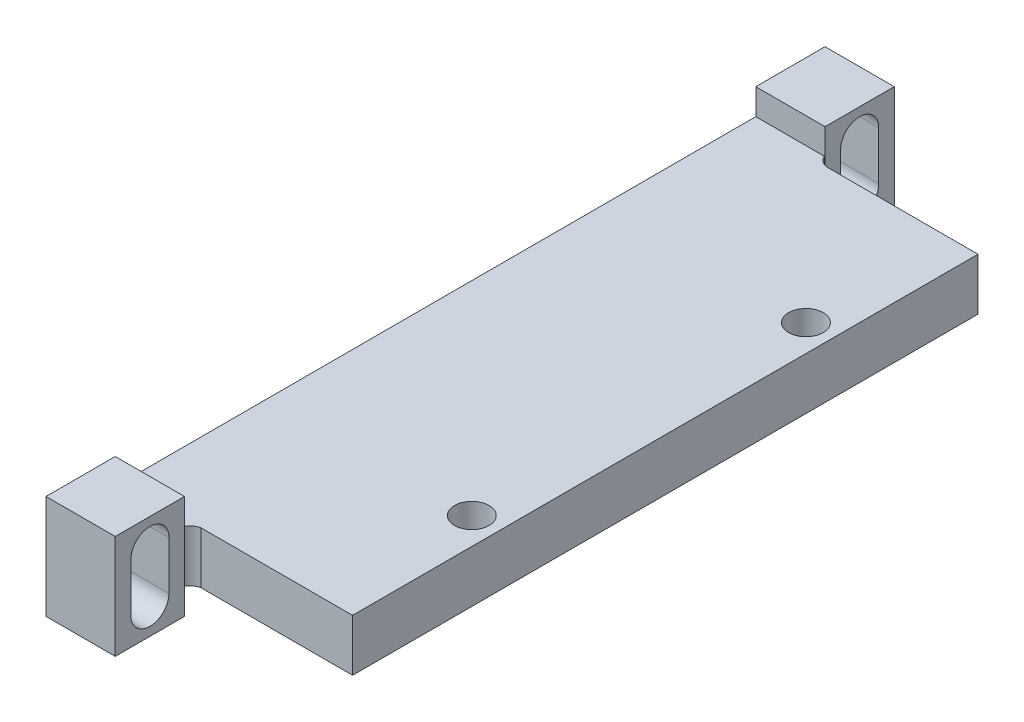
ISO-10303-21;
HEADER;
FILE_DESCRIPTION(('STEP AP214'),'2;1');
FILE_NAME('part.step','',(''),(''),'','','');
FILE_SCHEMA(('AUTOMOTIVE_DESIGN { 1 0 10303 214 1 1 1 1 }'));
ENDSEC;
DATA;
#1=APPLICATION_CONTEXT('core data for automotive mechanical design processes');
#2=APPLICATION_PROTOCOL_DEFINITION('international standard','automotive_design',2000,#1);
#3=PRODUCT_CONTEXT('',#1,'mechanical');
#4=PRODUCT('Part','Part','',(#3));
#5=PRODUCT_RELATED_PRODUCT_CATEGORY('part','',(#4));
#6=PRODUCT_DEFINITION_FORMATION('','',#4);
#7=PRODUCT_DEFINITION_CONTEXT('part definition',#1,'design');
#8=PRODUCT_DEFINITION('design','',#6,#7);
#9=PRODUCT_DEFINITION_SHAPE('','',#8);
#10=(LENGTH_UNIT() NAMED_UNIT(*) SI_UNIT(.MILLI.,.METRE.));
#11=(NAMED_UNIT(*) PLANE_ANGLE_UNIT() SI_UNIT($,.RADIAN.));
#12=(NAMED_UNIT(*) SI_UNIT($,.STERADIAN.) SOLID_ANGLE_UNIT());
#13=UNCERTAINTY_MEASURE_WITH_UNIT(LENGTH_MEASURE(1.E-05),#10,'distance_accuracy_value','');
#14=(GEOMETRIC_REPRESENTATION_CONTEXT(3) GLOBAL_UNCERTAINTY_ASSIGNED_CONTEXT((#13)) GLOBAL_UNIT_ASSIGNED_CONTEXT((#10,
#11,#12)) REPRESENTATION_CONTEXT('',''));
#15=CARTESIAN_POINT('',(0.,0.,0.));
#16=DIRECTION('',(0.,0.,1.));
#17=DIRECTION('',(1.,0.,0.));
#18=AXIS2_PLACEMENT_3D('',#15,#16,#17);
#19=CARTESIAN_POINT('',(2.,-3.,18.5));
#20=DIRECTION('',(1.,0.,0.));
#21=DIRECTION('',(0.,0.,-1.));
#22=AXIS2_PLACEMENT_3D('',#19,#20,#21);
#23=PLANE('',#22);
#24=CARTESIAN_POINT('',(2.,1.4,20.5));
#25=DIRECTION('',(1.,0.,0.));
#26=DIRECTION('',(0.,0.,-1.));
#27=AXIS2_PLACEMENT_3D('',#24,#25,#26);
#28=CIRCLE('',#27,1.1);
#29=CARTESIAN_POINT('',(2.,1.4,19.4));
#30=VERTEX_POINT('',#29);
#31=CARTESIAN_POINT('',(2.,1.4,21.6));
#32=VERTEX_POINT('',#31);
#33=EDGE_CURVE('E53',#30,#32,#28,.T.);
#34=ORIENTED_EDGE('',*,*,#33,.F.);
#35=DIRECTION('',(0.,1.,0.));
#36=VECTOR('',#35,1.);
#37=CARTESIAN_POINT('',(2.,1.4,19.4));
#38=LINE('',#37,#36);
#39=CARTESIAN_POINT('',(2.,-1.4,19.4));
#40=VERTEX_POINT('',#39);
#41=EDGE_CURVE('E216',#40,#30,#38,.T.);
#42=ORIENTED_EDGE('',*,*,#41,.F.);
#43=CARTESIAN_POINT('',(2.,-1.4,20.5));
#44=DIRECTION('',(1.,0.,0.));
#45=DIRECTION('',(0.,0.,-1.));
#46=AXIS2_PLACEMENT_3D('',#43,#44,#45);
#47=CIRCLE('',#46,1.1);
#48=CARTESIAN_POINT('',(2.,-1.4,21.6));
#49=VERTEX_POINT('',#48);
#50=EDGE_CURVE('E201',#49,#40,#47,.T.);
#51=ORIENTED_EDGE('',*,*,#50,.F.);
#52=DIRECTION('',(0.,-1.,0.));
#53=VECTOR('',#52,1.);
#54=CARTESIAN_POINT('',(2.,1.4,21.6));
#55=LINE('',#54,#53);
#56=EDGE_CURVE('E210',#32,#49,#55,.T.);
#57=ORIENTED_EDGE('',*,*,#56,.F.);
#58=EDGE_LOOP('',(#34,#42,#51,#57));
#59=FACE_BOUND('',#58,.T.);
#60=DIRECTION('',(0.,1.,0.));
#61=VECTOR('',#60,1.);
#62=CARTESIAN_POINT('',(2.,-3.,18.5));
#63=LINE('',#62,#61);
#64=CARTESIAN_POINT('',(2.,-3.,18.5));
#65=VERTEX_POINT('',#64);
#66=CARTESIAN_POINT('',(2.,3.,18.5));
#67=VERTEX_POINT('',#66);
#68=EDGE_CURVE('E664',#65,#67,#63,.T.);
#69=ORIENTED_EDGE('',*,*,#68,.T.);
#70=DIRECTION('',(0.,0.,-1.));
#71=VECTOR('',#70,1.);
#72=CARTESIAN_POINT('',(2.,3.,18.5));
#73=LINE('',#72,#71);
#74=CARTESIAN_POINT('',(2.,3.,22.5));
#75=VERTEX_POINT('',#74);
#76=EDGE_CURVE('E634',#75,#67,#73,.T.);
#77=ORIENTED_EDGE('',*,*,#76,.F.);
#78=DIRECTION('',(0.,1.,0.));
#79=VECTOR('',#78,1.);
#80=CARTESIAN_POINT('',(2.,-3.,22.5));
#81=LINE('',#80,#79);
#82=CARTESIAN_POINT('',(2.,-3.,22.5));
#83=VERTEX_POINT('',#82);
#84=EDGE_CURVE('E665',#83,#75,#81,.T.);
#85=ORIENTED_EDGE('',*,*,#84,.F.);
#86=DIRECTION('',(0.,0.,-1.));
#87=VECTOR('',#86,1.);
#88=CARTESIAN_POINT('',(2.,-3.,18.5));
#89=LINE('',#88,#87);
#90=EDGE_CURVE('E652',#83,#65,#89,.T.);
#91=ORIENTED_EDGE('',*,*,#90,.T.);
#92=EDGE_LOOP('',(#69,#77,#85,#91));
#93=FACE_BOUND('',#92,.T.);
#94=ADVANCED_FACE('F39',(#59,#93),#23,.T.);
#95=CARTESIAN_POINT('',(2.,-3.,22.5));
#96=DIRECTION('',(0.,0.,1.));
#97=DIRECTION('',(1.,0.,0.));
#98=AXIS2_PLACEMENT_3D('',#95,#96,#97);
#99=PLANE('',#98);
#100=ORIENTED_EDGE('',*,*,#84,.T.);
#101=DIRECTION('',(1.,0.,0.));
#102=VECTOR('',#101,1.);
#103=CARTESIAN_POINT('',(2.,3.,22.5));
#104=LINE('',#103,#102);
#105=CARTESIAN_POINT('',(-2.00000000000001,3.,22.5));
#106=VERTEX_POINT('',#105);
#107=EDGE_CURVE('E649',#106,#75,#104,.T.);
#108=ORIENTED_EDGE('',*,*,#107,.F.);
#109=DIRECTION('',(0.,1.,0.));
#110=VECTOR('',#109,1.);
#111=CARTESIAN_POINT('',(-2.00000000000001,-3.,22.5));
#112=LINE('',#111,#110);
#113=CARTESIAN_POINT('',(-2.00000000000001,-3.,22.5));
#114=VERTEX_POINT('',#113);
#115=EDGE_CURVE('E668',#114,#106,#112,.T.);
#116=ORIENTED_EDGE('',*,*,#115,.F.);
#117=DIRECTION('',(1.,0.,0.));
#118=VECTOR('',#117,1.);
#119=CARTESIAN_POINT('',(2.,-3.,22.5));
#120=LINE('',#119,#118);
#121=EDGE_CURVE('E661',#114,#83,#120,.T.);
#122=ORIENTED_EDGE('',*,*,#121,.T.);
#123=EDGE_LOOP('',(#100,#108,#116,#122));
#124=FACE_BOUND('',#123,.T.);
#125=ADVANCED_FACE('F363',(#124),#99,.T.);
#126=CARTESIAN_POINT('',(-1.99999999999999,-3.,18.5));
#127=DIRECTION('',(-1.,0.,0.));
#128=DIRECTION('',(0.,0.,1.));
#129=AXIS2_PLACEMENT_3D('',#126,#127,#128);
#130=PLANE('',#129);
#131=CARTESIAN_POINT('',(-2.,1.4,20.5));
#132=DIRECTION('',(-1.,0.,0.));
#133=DIRECTION('',(0.,0.,1.));
#134=AXIS2_PLACEMENT_3D('',#131,#132,#133);
#135=CIRCLE('',#134,1.1);
#136=CARTESIAN_POINT('',(-2.00000000000001,1.4,21.6));
#137=VERTEX_POINT('',#136);
#138=CARTESIAN_POINT('',(-2.,1.4,19.4));
#139=VERTEX_POINT('',#138);
#140=EDGE_CURVE('E11',#137,#139,#135,.T.);
#141=ORIENTED_EDGE('',*,*,#140,.F.);
#142=DIRECTION('',(0.,1.,0.));
#143=VECTOR('',#142,1.);
#144=CARTESIAN_POINT('',(-2.00000000000001,-3.,21.6));
#145=LINE('',#144,#143);
#146=CARTESIAN_POINT('',(-2.00000000000001,-1.4,21.6));
#147=VERTEX_POINT('',#146);
#148=EDGE_CURVE('E685',#147,#137,#145,.T.);
#149=ORIENTED_EDGE('',*,*,#148,.F.);
#150=CARTESIAN_POINT('',(-2.,-1.4,20.5));
#151=DIRECTION('',(-1.,0.,0.));
#152=DIRECTION('',(0.,0.,1.));
#153=AXIS2_PLACEMENT_3D('',#150,#151,#152);
#154=CIRCLE('',#153,1.1);
#155=CARTESIAN_POINT('',(-2.00000000000001,-1.4,19.4));
#156=VERTEX_POINT('',#155);
#157=EDGE_CURVE('E204',#156,#147,#154,.T.);
#158=ORIENTED_EDGE('',*,*,#157,.F.);
#159=DIRECTION('',(0.,-1.,0.));
#160=VECTOR('',#159,1.);
#161=CARTESIAN_POINT('',(-2.,-3.,19.4));
#162=LINE('',#161,#160);
#163=EDGE_CURVE('E46',#139,#156,#162,.T.);
#164=ORIENTED_EDGE('',*,*,#163,.F.);
#165=EDGE_LOOP('',(#141,#149,#158,#164));
#166=FACE_BOUND('',#165,.T.);
#167=CARTESIAN_POINT('',(-1.99999999999986,1.4,-20.5));
#168=DIRECTION('',(-1.,0.,0.));
#169=DIRECTION('',(0.,0.,1.));
#170=AXIS2_PLACEMENT_3D('',#167,#168,#169);
#171=CIRCLE('',#170,1.1);
#172=CARTESIAN_POINT('',(-1.99999999999986,1.4,-19.4));
#173=VERTEX_POINT('',#172);
#174=CARTESIAN_POINT('',(-1.99999999999986,1.4,-21.6));
#175=VERTEX_POINT('',#174);
#176=EDGE_CURVE('E252',#173,#175,#171,.T.);
#177=ORIENTED_EDGE('',*,*,#176,.F.);
#178=DIRECTION('',(0.,1.,0.));
#179=VECTOR('',#178,1.);
#180=CARTESIAN_POINT('',(-1.99999999999986,-3.,-19.4));
#181=LINE('',#180,#179);
#182=CARTESIAN_POINT('',(-1.99999999999986,-1.4,-19.4));
#183=VERTEX_POINT('',#182);
#184=EDGE_CURVE('E223',#183,#173,#181,.T.);
#185=ORIENTED_EDGE('',*,*,#184,.F.);
#186=CARTESIAN_POINT('',(-1.99999999999986,-1.4,-20.5));
#187=DIRECTION('',(-1.,0.,0.));
#188=DIRECTION('',(0.,0.,1.));
#189=AXIS2_PLACEMENT_3D('',#186,#187,#188);
#190=CIRCLE('',#189,1.1);
#191=CARTESIAN_POINT('',(-1.99999999999986,-1.4,-21.6));
#192=VERTEX_POINT('',#191);
#193=EDGE_CURVE('E247',#192,#183,#190,.T.);
#194=ORIENTED_EDGE('',*,*,#193,.F.);
#195=DIRECTION('',(0.,-1.,0.));
#196=VECTOR('',#195,1.);
#197=CARTESIAN_POINT('',(-1.99999999999986,-3.,-21.6));
#198=LINE('',#197,#196);
#199=EDGE_CURVE('E250',#175,#192,#198,.T.);
#200=ORIENTED_EDGE('',*,*,#199,.F.);
#201=EDGE_LOOP('',(#177,#185,#194,#200));
#202=FACE_BOUND('',#201,.T.);
#203=DIRECTION('',(0.,0.,1.));
#204=VECTOR('',#203,1.);
#205=CARTESIAN_POINT('',(-2.,1.5,18.6272849993779));
#206=LINE('',#205,#204);
#207=CARTESIAN_POINT('',(-1.99999999999999,1.5,-18.5));
#208=VERTEX_POINT('',#207);
#209=CARTESIAN_POINT('',(-1.99999999999999,1.5,18.5));
#210=VERTEX_POINT('',#209);
#211=EDGE_CURVE('E306',#208,#210,#206,.T.);
#212=ORIENTED_EDGE('',*,*,#211,.F.);
#213=DIRECTION('',(0.,1.,0.));
#214=VECTOR('',#213,1.);
#215=CARTESIAN_POINT('',(-1.99999999999999,-3.,-18.5));
#216=LINE('',#215,#214);
#217=CARTESIAN_POINT('',(-1.99999999999999,3.,-18.5));
#218=VERTEX_POINT('',#217);
#219=EDGE_CURVE('E275',#208,#218,#216,.T.);
#220=ORIENTED_EDGE('',*,*,#219,.T.);
#221=DIRECTION('',(0.,0.,1.));
#222=VECTOR('',#221,1.);
#223=CARTESIAN_POINT('',(-1.99999999999999,3.,-18.5));
#224=LINE('',#223,#222);
#225=CARTESIAN_POINT('',(-2.,3.,-22.5));
#226=VERTEX_POINT('',#225);
#227=EDGE_CURVE('E291',#226,#218,#224,.T.);
#228=ORIENTED_EDGE('',*,*,#227,.F.);
#229=DIRECTION('',(0.,1.,0.));
#230=VECTOR('',#229,1.);
#231=CARTESIAN_POINT('',(-2.,-3.,-22.5));
#232=LINE('',#231,#230);
#233=CARTESIAN_POINT('',(-2.,-3.,-22.5));
#234=VERTEX_POINT('',#233);
#235=EDGE_CURVE('E270',#234,#226,#232,.T.);
#236=ORIENTED_EDGE('',*,*,#235,.F.);
#237=DIRECTION('',(0.,0.,1.));
#238=VECTOR('',#237,1.);
#239=CARTESIAN_POINT('',(-1.99999999999999,-3.,-18.5));
#240=LINE('',#239,#238);
#241=CARTESIAN_POINT('',(-1.99999999999999,-3.,-18.5));
#242=VERTEX_POINT('',#241);
#243=EDGE_CURVE('E279',#234,#242,#240,.T.);
#244=ORIENTED_EDGE('',*,*,#243,.T.);
#245=CARTESIAN_POINT('',(-1.99999999999999,-1.5,-18.5));
#246=VERTEX_POINT('',#245);
#247=EDGE_CURVE('E272',#242,#246,#216,.T.);
#248=ORIENTED_EDGE('',*,*,#247,.T.);
#249=DIRECTION('',(0.,0.,1.));
#250=VECTOR('',#249,1.);
#251=CARTESIAN_POINT('',(-2.,-1.5,18.6272849993779));
#252=LINE('',#251,#250);
#253=CARTESIAN_POINT('',(-2.,-1.5,18.5));
#254=VERTEX_POINT('',#253);
#255=EDGE_CURVE('E329',#246,#254,#252,.T.);
#256=ORIENTED_EDGE('',*,*,#255,.T.);
#257=DIRECTION('',(0.,1.,0.));
#258=VECTOR('',#257,1.);
#259=CARTESIAN_POINT('',(-1.99999999999999,-3.,18.5));
#260=LINE('',#259,#258);
#261=CARTESIAN_POINT('',(-1.99999999999999,-3.,18.5));
#262=VERTEX_POINT('',#261);
#263=EDGE_CURVE('E670',#262,#254,#260,.T.);
#264=ORIENTED_EDGE('',*,*,#263,.F.);
#265=DIRECTION('',(0.,0.,1.));
#266=VECTOR('',#265,1.);
#267=CARTESIAN_POINT('',(-1.99999999999999,-3.,18.5));
#268=LINE('',#267,#266);
#269=EDGE_CURVE('E658',#262,#114,#268,.T.);
#270=ORIENTED_EDGE('',*,*,#269,.T.);
#271=ORIENTED_EDGE('',*,*,#115,.T.);
#272=DIRECTION('',(0.,0.,1.));
#273=VECTOR('',#272,1.);
#274=CARTESIAN_POINT('',(-1.99999999999999,3.,18.5));
#275=LINE('',#274,#273);
#276=CARTESIAN_POINT('',(-1.99999999999999,3.,18.5));
#277=VERTEX_POINT('',#276);
#278=EDGE_CURVE('E646',#277,#106,#275,.T.);
#279=ORIENTED_EDGE('',*,*,#278,.F.);
#280=EDGE_CURVE('E673',#210,#277,#260,.T.);
#281=ORIENTED_EDGE('',*,*,#280,.F.);
#282=EDGE_LOOP('',(#212,#220,#228,#236,#244,#248,#256,#264,#270,#271,#279,#281));
#283=FACE_BOUND('',#282,.T.);
#284=ADVANCED_FACE('F366',(#166,#202,#283),#130,.T.);
#285=CARTESIAN_POINT('',(2.,-3.,18.5));
#286=DIRECTION('',(0.,0.,-1.));
#287=DIRECTION('',(-1.,0.,0.));
#288=AXIS2_PLACEMENT_3D('',#285,#286,#287);
#289=PLANE('',#288);
#290=DIRECTION('',(-1.,0.,0.));
#291=VECTOR('',#290,1.);
#292=CARTESIAN_POINT('',(2.,-1.5,18.5));
#293=LINE('',#292,#291);
#294=CARTESIAN_POINT('',(1.98732079648267,-1.5,18.4999999968928));
#295=VERTEX_POINT('',#294);
#296=EDGE_CURVE('E679',#295,#254,#293,.T.);
#297=ORIENTED_EDGE('',*,*,#296,.F.);
#298=DIRECTION('',(0.,1.,0.));
#299=VECTOR('',#298,1.);
#300=CARTESIAN_POINT('',(1.98732079480056,-1.5,18.5));
#301=LINE('',#300,#299);
#302=CARTESIAN_POINT('',(1.98732079648267,1.5,18.4999999968928));
#303=VERTEX_POINT('',#302);
#304=EDGE_CURVE('E677',#303,#295,#301,.F.);
#305=ORIENTED_EDGE('',*,*,#304,.F.);
#306=DIRECTION('',(-1.,0.,0.));
#307=VECTOR('',#306,1.);
#308=CARTESIAN_POINT('',(2.,1.5,18.5));
#309=LINE('',#308,#307);
#310=EDGE_CURVE('E667',#303,#210,#309,.T.);
#311=ORIENTED_EDGE('',*,*,#310,.T.);
#312=ORIENTED_EDGE('',*,*,#280,.T.);
#313=DIRECTION('',(-1.,0.,0.));
#314=VECTOR('',#313,1.);
#315=CARTESIAN_POINT('',(2.,3.,18.5));
#316=LINE('',#315,#314);
#317=EDGE_CURVE('E643',#67,#277,#316,.T.);
#318=ORIENTED_EDGE('',*,*,#317,.F.);
#319=ORIENTED_EDGE('',*,*,#68,.F.);
#320=DIRECTION('',(-1.,0.,0.));
#321=VECTOR('',#320,1.);
#322=CARTESIAN_POINT('',(2.,-3.,18.5));
#323=LINE('',#322,#321);
#324=EDGE_CURVE('E655',#65,#262,#323,.T.);
#325=ORIENTED_EDGE('',*,*,#324,.T.);
#326=ORIENTED_EDGE('',*,*,#263,.T.);
#327=EDGE_LOOP('',(#297,#305,#311,#312,#318,#319,#325,#326));
#328=FACE_BOUND('',#327,.T.);
#329=ADVANCED_FACE('F361',(#328),#289,.T.);
#330=CARTESIAN_POINT('',(0.,-3.,0.));
#331=DIRECTION('',(0.,-1.,0.));
#332=DIRECTION('',(0.,0.,-1.));
#333=AXIS2_PLACEMENT_3D('',#330,#331,#332);
#334=PLANE('',#333);
#335=ORIENTED_EDGE('',*,*,#90,.F.);
#336=ORIENTED_EDGE('',*,*,#121,.F.);
#337=ORIENTED_EDGE('',*,*,#269,.F.);
#338=ORIENTED_EDGE('',*,*,#324,.F.);
#339=EDGE_LOOP('',(#335,#336,#337,#338));
#340=FACE_BOUND('',#339,.T.);
#341=ADVANCED_FACE('F357',(#340),#334,.T.);
#342=CARTESIAN_POINT('',(0.,3.,0.));
#343=DIRECTION('',(0.,-1.,0.));
#344=DIRECTION('',(0.,0.,-1.));
#345=AXIS2_PLACEMENT_3D('',#342,#343,#344);
#346=PLANE('',#345);
#347=ORIENTED_EDGE('',*,*,#76,.T.);
#348=ORIENTED_EDGE('',*,*,#317,.T.);
#349=ORIENTED_EDGE('',*,*,#278,.T.);
#350=ORIENTED_EDGE('',*,*,#107,.T.);
#351=EDGE_LOOP('',(#347,#348,#349,#350));
#352=FACE_BOUND('',#351,.T.);
#353=ADVANCED_FACE('F353',(#352),#346,.F.);
#354=CARTESIAN_POINT('',(2.53620166485848,-1.5,-18.0357754190136));
#355=CARTESIAN_POINT('',(2.08814530203309,-1.5,-18.1442144488754));
#356=CARTESIAN_POINT('',(1.93000000000001,-1.5,-18.5715688843777));
#357=B_SPLINE_CURVE_WITH_KNOTS('',2,(#354,#355,#356),.UNSPECIFIED.,.F.,.F.,(3,3),(0.,1.),.UNSPECIFIED.);
#358=DIRECTION('',(0.,1.,0.));
#359=VECTOR('',#358,1.);
#360=SURFACE_OF_LINEAR_EXTRUSION('',#357,#359);
#361=DIRECTION('',(0.,1.,0.));
#362=VECTOR('',#361,1.);
#363=CARTESIAN_POINT('',(1.95953876147195,-1.5,-18.5));
#364=LINE('',#363,#362);
#365=CARTESIAN_POINT('',(1.95953875712856,1.5,-18.5000000094761));
#366=VERTEX_POINT('',#365);
#367=CARTESIAN_POINT('',(1.95953875712856,-1.5,-18.5000000094761));
#368=VERTEX_POINT('',#367);
#369=EDGE_CURVE('E300',#366,#368,#364,.F.);
#370=ORIENTED_EDGE('',*,*,#369,.F.);
#371=CARTESIAN_POINT('',(2.53620166485848,1.5,-18.0357754190136));
#372=CARTESIAN_POINT('',(2.08814530203309,1.5,-18.1442144488754));
#373=CARTESIAN_POINT('',(1.93000000000001,1.5,-18.5715688843777));
#374=B_SPLINE_CURVE_WITH_KNOTS('',2,(#371,#372,#373),.UNSPECIFIED.,.F.,.F.,(3,3),(0.,1.),.UNSPECIFIED.);
#375=CARTESIAN_POINT('',(2.53620166485848,1.5,-18.0357754190136));
#376=VERTEX_POINT('',#375);
#377=EDGE_CURVE('E324',#376,#366,#374,.T.);
#378=ORIENTED_EDGE('',*,*,#377,.F.);
#379=DIRECTION('',(0.,1.,0.));
#380=VECTOR('',#379,1.);
#381=CARTESIAN_POINT('',(2.53620166485848,-1.5,-18.0357754190136));
#382=LINE('',#381,#380);
#383=CARTESIAN_POINT('',(2.53620166485848,-1.5,-18.0357754190136));
#384=VERTEX_POINT('',#383);
#385=EDGE_CURVE('E629',#384,#376,#382,.T.);
#386=ORIENTED_EDGE('',*,*,#385,.F.);
#387=EDGE_CURVE('E620',#384,#368,#357,.T.);
#388=ORIENTED_EDGE('',*,*,#387,.T.);
#389=EDGE_LOOP('',(#370,#378,#386,#388));
#390=FACE_BOUND('',#389,.T.);
#391=ADVANCED_FACE('F356',(#390),#360,.T.);
#392=CARTESIAN_POINT('',(2.53620166485848,-1.5,-18.0357754190136));
#393=DIRECTION('',(0.,0.,-1.));
#394=DIRECTION('',(-1.,0.,0.));
#395=AXIS2_PLACEMENT_3D('',#392,#393,#394);
#396=PLANE('',#395);
#397=ORIENTED_EDGE('',*,*,#385,.T.);
#398=DIRECTION('',(-1.,0.,0.));
#399=VECTOR('',#398,1.);
#400=CARTESIAN_POINT('',(2.53620166485848,1.5,-18.0357754190136));
#401=LINE('',#400,#399);
#402=CARTESIAN_POINT('',(11.3006257848585,1.5,-18.0357754190136));
#403=VERTEX_POINT('',#402);
#404=EDGE_CURVE('E321',#403,#376,#401,.T.);
#405=ORIENTED_EDGE('',*,*,#404,.F.);
#406=DIRECTION('',(0.,1.,0.));
#407=VECTOR('',#406,1.);
#408=CARTESIAN_POINT('',(11.3006257848585,-1.5,-18.0357754190136));
#409=LINE('',#408,#407);
#410=CARTESIAN_POINT('',(11.3006257848585,-1.5,-18.0357754190136));
#411=VERTEX_POINT('',#410);
#412=EDGE_CURVE('E635',#411,#403,#409,.T.);
#413=ORIENTED_EDGE('',*,*,#412,.F.);
#414=DIRECTION('',(-1.,0.,0.));
#415=VECTOR('',#414,1.);
#416=CARTESIAN_POINT('',(2.53620166485848,-1.5,-18.0357754190136));
#417=LINE('',#416,#415);
#418=EDGE_CURVE('E628',#411,#384,#417,.T.);
#419=ORIENTED_EDGE('',*,*,#418,.T.);
#420=EDGE_LOOP('',(#397,#405,#413,#419));
#421=FACE_BOUND('',#420,.T.);
#422=ADVANCED_FACE('F530',(#421),#396,.T.);
#423=CARTESIAN_POINT('',(11.3006257848585,-1.5,-18.0357754190136));
#424=DIRECTION('',(1.,0.,0.));
#425=DIRECTION('',(0.,0.,-1.));
#426=AXIS2_PLACEMENT_3D('',#423,#424,#425);
#427=PLANE('',#426);
#428=ORIENTED_EDGE('',*,*,#412,.T.);
#429=DIRECTION('',(0.,0.,-1.));
#430=VECTOR('',#429,1.);
#431=CARTESIAN_POINT('',(11.3006257848585,1.5,-18.0357754190136));
#432=LINE('',#431,#430);
#433=CARTESIAN_POINT('',(11.3006257848585,1.5,18.0914915340138));
#434=VERTEX_POINT('',#433);
#435=EDGE_CURVE('E318',#434,#403,#432,.T.);
#436=ORIENTED_EDGE('',*,*,#435,.F.);
#437=DIRECTION('',(0.,1.,0.));
#438=VECTOR('',#437,1.);
#439=CARTESIAN_POINT('',(11.3006257848585,-1.5,18.0914915340138));
#440=LINE('',#439,#438);
#441=CARTESIAN_POINT('',(11.3006257848585,-1.5,18.0914915340138));
#442=VERTEX_POINT('',#441);
#443=EDGE_CURVE('E637',#442,#434,#440,.T.);
#444=ORIENTED_EDGE('',*,*,#443,.F.);
#445=DIRECTION('',(0.,0.,-1.));
#446=VECTOR('',#445,1.);
#447=CARTESIAN_POINT('',(11.3006257848585,-1.5,-18.0357754190136));
#448=LINE('',#447,#446);
#449=EDGE_CURVE('E729',#442,#411,#448,.T.);
#450=ORIENTED_EDGE('',*,*,#449,.T.);
#451=EDGE_LOOP('',(#428,#436,#444,#450));
#452=FACE_BOUND('',#451,.T.);
#453=ADVANCED_FACE('F522',(#452),#427,.T.);
#454=CARTESIAN_POINT('',(11.3006257848585,-1.5,18.0914915340138));
#455=DIRECTION('',(0.,0.,1.));
#456=DIRECTION('',(1.,0.,0.));
#457=AXIS2_PLACEMENT_3D('',#454,#455,#456);
#458=PLANE('',#457);
#459=ORIENTED_EDGE('',*,*,#443,.T.);
#460=DIRECTION('',(1.,0.,0.));
#461=VECTOR('',#460,1.);
#462=CARTESIAN_POINT('',(11.3006257848585,1.5,18.0914915340138));
#463=LINE('',#462,#461);
#464=CARTESIAN_POINT('',(2.53620166485848,1.5,18.0914915340138));
#465=VERTEX_POINT('',#464);
#466=EDGE_CURVE('E312',#465,#434,#463,.T.);
#467=ORIENTED_EDGE('',*,*,#466,.F.);
#468=DIRECTION('',(0.,1.,0.));
#469=VECTOR('',#468,1.);
#470=CARTESIAN_POINT('',(2.53620166485848,-1.5,18.0914915340138));
#471=LINE('',#470,#469);
#472=CARTESIAN_POINT('',(2.53620166485848,-1.5,18.0914915340138));
#473=VERTEX_POINT('',#472);
#474=EDGE_CURVE('E627',#473,#465,#471,.T.);
#475=ORIENTED_EDGE('',*,*,#474,.F.);
#476=DIRECTION('',(1.,0.,0.));
#477=VECTOR('',#476,1.);
#478=CARTESIAN_POINT('',(11.3006257848585,-1.5,18.0914915340138));
#479=LINE('',#478,#477);
#480=EDGE_CURVE('E339',#473,#442,#479,.T.);
#481=ORIENTED_EDGE('',*,*,#480,.T.);
#482=EDGE_LOOP('',(#459,#467,#475,#481));
#483=FACE_BOUND('',#482,.T.);
#484=ADVANCED_FACE('F350',(#483),#458,.T.);
#485=CARTESIAN_POINT('',(1.93000000000005,-1.5,18.6272849993779));
#486=CARTESIAN_POINT('',(2.08814530203307,-1.5,18.1999305638756));
#487=CARTESIAN_POINT('',(2.53620166485848,-1.5,18.0914915340138));
#488=B_SPLINE_CURVE_WITH_KNOTS('',2,(#485,#486,#487),.UNSPECIFIED.,.F.,.F.,(3,3),(0.,1.),.UNSPECIFIED.);
#489=DIRECTION('',(0.,1.,0.));
#490=VECTOR('',#489,1.);
#491=SURFACE_OF_LINEAR_EXTRUSION('',#488,#490);
#492=CARTESIAN_POINT('',(1.93000000000005,1.5,18.6272849993779));
#493=CARTESIAN_POINT('',(2.08814530203307,1.5,18.1999305638756));
#494=CARTESIAN_POINT('',(2.53620166485848,1.5,18.0914915340138));
#495=B_SPLINE_CURVE_WITH_KNOTS('',2,(#492,#493,#494),.UNSPECIFIED.,.F.,.F.,(3,3),(0.,1.),.UNSPECIFIED.);
#496=EDGE_CURVE('E308',#303,#465,#495,.T.);
#497=ORIENTED_EDGE('',*,*,#496,.F.);
#498=ORIENTED_EDGE('',*,*,#304,.T.);
#499=EDGE_CURVE('E334',#295,#473,#488,.T.);
#500=ORIENTED_EDGE('',*,*,#499,.T.);
#501=ORIENTED_EDGE('',*,*,#474,.T.);
#502=EDGE_LOOP('',(#497,#498,#500,#501));
#503=FACE_BOUND('',#502,.T.);
#504=ADVANCED_FACE('F345',(#503),#491,.T.);
#505=CARTESIAN_POINT('',(2.16062306723117,-1.5,-18.2239433002855));
#506=DIRECTION('',(0.,-1.,0.));
#507=DIRECTION('',(0.,0.,-1.));
#508=AXIS2_PLACEMENT_3D('',#505,#506,#507);
#509=PLANE('',#508);
#510=CARTESIAN_POINT('',(9.75000000000001,-1.5,-9.64586794649479));
#511=DIRECTION('',(0.,-1.,0.));
#512=DIRECTION('',(0.,0.,-1.));
#513=AXIS2_PLACEMENT_3D('',#510,#511,#512);
#514=CIRCLE('',#513,1.);
#515=CARTESIAN_POINT('',(9.75000000000001,-1.5,-10.6458679464948));
#516=VERTEX_POINT('',#515);
#517=EDGE_CURVE('E263',#516,#516,#514,.T.);
#518=ORIENTED_EDGE('',*,*,#517,.F.);
#519=EDGE_LOOP('',(#518));
#520=FACE_BOUND('',#519,.T.);
#521=CARTESIAN_POINT('',(9.75000000000001,-1.5,9.65413205350522));
#522=DIRECTION('',(0.,-1.,0.));
#523=DIRECTION('',(0.,0.,-1.));
#524=AXIS2_PLACEMENT_3D('',#521,#522,#523);
#525=CIRCLE('',#524,0.999999999999999);
#526=CARTESIAN_POINT('',(9.75000000000001,-1.5,8.65413205350522));
#527=VERTEX_POINT('',#526);
#528=EDGE_CURVE('E258',#527,#527,#525,.T.);
#529=ORIENTED_EDGE('',*,*,#528,.F.);
#530=EDGE_LOOP('',(#529));
#531=FACE_BOUND('',#530,.T.);
#532=DIRECTION('',(-1.,0.,0.));
#533=VECTOR('',#532,1.);
#534=CARTESIAN_POINT('',(2.16062306723117,-1.5,-18.5));
#535=LINE('',#534,#533);
#536=EDGE_CURVE('E303',#368,#246,#535,.T.);
#537=ORIENTED_EDGE('',*,*,#536,.F.);
#538=ORIENTED_EDGE('',*,*,#387,.F.);
#539=ORIENTED_EDGE('',*,*,#418,.F.);
#540=ORIENTED_EDGE('',*,*,#449,.F.);
#541=ORIENTED_EDGE('',*,*,#480,.F.);
#542=ORIENTED_EDGE('',*,*,#499,.F.);
#543=ORIENTED_EDGE('',*,*,#296,.T.);
#544=ORIENTED_EDGE('',*,*,#255,.F.);
#545=EDGE_LOOP('',(#537,#538,#539,#540,#541,#542,#543,#544));
#546=FACE_BOUND('',#545,.T.);
#547=ADVANCED_FACE('F349',(#520,#531,#546),#509,.T.);
#548=CARTESIAN_POINT('',(2.16062306723117,1.5,-18.2239433002855));
#549=DIRECTION('',(0.,-1.,0.));
#550=DIRECTION('',(0.,0.,-1.));
#551=AXIS2_PLACEMENT_3D('',#548,#549,#550);
#552=PLANE('',#551);
#553=CARTESIAN_POINT('',(9.75000000000001,1.5,-9.64586794649479));
#554=DIRECTION('',(0.,1.,0.));
#555=DIRECTION('',(0.,0.,1.));
#556=AXIS2_PLACEMENT_3D('',#553,#554,#555);
#557=CIRCLE('',#556,1.);
#558=CARTESIAN_POINT('',(9.75000000000001,1.5,-8.64586794649479));
#559=VERTEX_POINT('',#558);
#560=EDGE_CURVE('E255',#559,#559,#557,.T.);
#561=ORIENTED_EDGE('',*,*,#560,.F.);
#562=EDGE_LOOP('',(#561));
#563=FACE_BOUND('',#562,.T.);
#564=CARTESIAN_POINT('',(9.75000000000001,1.5,9.65413205350522));
#565=DIRECTION('',(0.,1.,0.));
#566=DIRECTION('',(0.,0.,-1.));
#567=AXIS2_PLACEMENT_3D('',#564,#565,#566);
#568=CIRCLE('',#567,0.999999999999999);
#569=CARTESIAN_POINT('',(9.75000000000001,1.5,8.65413205350522));
#570=VERTEX_POINT('',#569);
#571=EDGE_CURVE('E254',#570,#570,#568,.T.);
#572=ORIENTED_EDGE('',*,*,#571,.F.);
#573=EDGE_LOOP('',(#572));
#574=FACE_BOUND('',#573,.T.);
#575=ORIENTED_EDGE('',*,*,#377,.T.);
#576=DIRECTION('',(-1.,0.,0.));
#577=VECTOR('',#576,1.);
#578=CARTESIAN_POINT('',(2.16062306723117,1.5,-18.5));
#579=LINE('',#578,#577);
#580=EDGE_CURVE('E682',#366,#208,#579,.T.);
#581=ORIENTED_EDGE('',*,*,#580,.T.);
#582=ORIENTED_EDGE('',*,*,#211,.T.);
#583=ORIENTED_EDGE('',*,*,#310,.F.);
#584=ORIENTED_EDGE('',*,*,#496,.T.);
#585=ORIENTED_EDGE('',*,*,#466,.T.);
#586=ORIENTED_EDGE('',*,*,#435,.T.);
#587=ORIENTED_EDGE('',*,*,#404,.T.);
#588=EDGE_LOOP('',(#575,#581,#582,#583,#584,#585,#586,#587));
#589=FACE_BOUND('',#588,.T.);
#590=ADVANCED_FACE('F400',(#563,#574,#589),#552,.F.);
#591=CARTESIAN_POINT('',(2.00000000000001,-3.,-18.5));
#592=DIRECTION('',(1.,0.,0.));
#593=DIRECTION('',(0.,0.,-1.));
#594=AXIS2_PLACEMENT_3D('',#591,#592,#593);
#595=PLANE('',#594);
#596=CARTESIAN_POINT('',(2.,1.4,-20.5));
#597=DIRECTION('',(1.,0.,0.));
#598=DIRECTION('',(0.,0.,1.));
#599=AXIS2_PLACEMENT_3D('',#596,#597,#598);
#600=CIRCLE('',#599,1.1);
#601=CARTESIAN_POINT('',(2.,1.4,-21.6));
#602=VERTEX_POINT('',#601);
#603=CARTESIAN_POINT('',(2.00000000000001,1.4,-19.4));
#604=VERTEX_POINT('',#603);
#605=EDGE_CURVE('E244',#602,#604,#600,.T.);
#606=ORIENTED_EDGE('',*,*,#605,.F.);
#607=DIRECTION('',(0.,1.,0.));
#608=VECTOR('',#607,1.);
#609=CARTESIAN_POINT('',(2.,1.4,-21.6));
#610=LINE('',#609,#608);
#611=CARTESIAN_POINT('',(2.,-1.4,-21.6));
#612=VERTEX_POINT('',#611);
#613=EDGE_CURVE('E229',#612,#602,#610,.T.);
#614=ORIENTED_EDGE('',*,*,#613,.F.);
#615=CARTESIAN_POINT('',(2.,-1.4,-20.5));
#616=DIRECTION('',(1.,0.,0.));
#617=DIRECTION('',(0.,0.,1.));
#618=AXIS2_PLACEMENT_3D('',#615,#616,#617);
#619=CIRCLE('',#618,1.1);
#620=CARTESIAN_POINT('',(2.,-1.4,-19.4));
#621=VERTEX_POINT('',#620);
#622=EDGE_CURVE('E238',#621,#612,#619,.T.);
#623=ORIENTED_EDGE('',*,*,#622,.F.);
#624=DIRECTION('',(0.,-1.,0.));
#625=VECTOR('',#624,1.);
#626=CARTESIAN_POINT('',(2.,1.4,-19.4));
#627=LINE('',#626,#625);
#628=EDGE_CURVE('E241',#604,#621,#627,.T.);
#629=ORIENTED_EDGE('',*,*,#628,.F.);
#630=EDGE_LOOP('',(#606,#614,#623,#629));
#631=FACE_BOUND('',#630,.T.);
#632=DIRECTION('',(0.,1.,0.));
#633=VECTOR('',#632,1.);
#634=CARTESIAN_POINT('',(2.00000000000001,-3.,-22.5));
#635=LINE('',#634,#633);
#636=CARTESIAN_POINT('',(2.00000000000001,-3.,-22.5));
#637=VERTEX_POINT('',#636);
#638=CARTESIAN_POINT('',(2.00000000000001,3.,-22.5));
#639=VERTEX_POINT('',#638);
#640=EDGE_CURVE('E267',#637,#639,#635,.T.);
#641=ORIENTED_EDGE('',*,*,#640,.T.);
#642=DIRECTION('',(0.,0.,-1.));
#643=VECTOR('',#642,1.);
#644=CARTESIAN_POINT('',(2.00000000000001,3.,-18.5));
#645=LINE('',#644,#643);
#646=CARTESIAN_POINT('',(2.00000000000001,3.,-18.5));
#647=VERTEX_POINT('',#646);
#648=EDGE_CURVE('E297',#647,#639,#645,.T.);
#649=ORIENTED_EDGE('',*,*,#648,.F.);
#650=DIRECTION('',(0.,1.,0.));
#651=VECTOR('',#650,1.);
#652=CARTESIAN_POINT('',(2.00000000000001,-3.,-18.5));
#653=LINE('',#652,#651);
#654=CARTESIAN_POINT('',(2.00000000000001,-3.,-18.5));
#655=VERTEX_POINT('',#654);
#656=EDGE_CURVE('E266',#655,#647,#653,.T.);
#657=ORIENTED_EDGE('',*,*,#656,.F.);
#658=DIRECTION('',(0.,0.,-1.));
#659=VECTOR('',#658,1.);
#660=CARTESIAN_POINT('',(2.00000000000001,-3.,-18.5));
#661=LINE('',#660,#659);
#662=EDGE_CURVE('E285',#655,#637,#661,.T.);
#663=ORIENTED_EDGE('',*,*,#662,.T.);
#664=EDGE_LOOP('',(#641,#649,#657,#663));
#665=FACE_BOUND('',#664,.T.);
#666=ADVANCED_FACE('F395',(#631,#665),#595,.T.);
#667=CARTESIAN_POINT('',(2.00000000000001,-3.,-18.5));
#668=DIRECTION('',(0.,0.,1.));
#669=DIRECTION('',(1.,0.,0.));
#670=AXIS2_PLACEMENT_3D('',#667,#668,#669);
#671=PLANE('',#670);
#672=ORIENTED_EDGE('',*,*,#369,.T.);
#673=ORIENTED_EDGE('',*,*,#536,.T.);
#674=ORIENTED_EDGE('',*,*,#247,.F.);
#675=DIRECTION('',(1.,0.,0.));
#676=VECTOR('',#675,1.);
#677=CARTESIAN_POINT('',(2.00000000000001,-3.,-18.5));
#678=LINE('',#677,#676);
#679=EDGE_CURVE('E269',#242,#655,#678,.T.);
#680=ORIENTED_EDGE('',*,*,#679,.T.);
#681=ORIENTED_EDGE('',*,*,#656,.T.);
#682=DIRECTION('',(1.,0.,0.));
#683=VECTOR('',#682,1.);
#684=CARTESIAN_POINT('',(2.00000000000001,3.,-18.5));
#685=LINE('',#684,#683);
#686=EDGE_CURVE('E288',#218,#647,#685,.T.);
#687=ORIENTED_EDGE('',*,*,#686,.F.);
#688=ORIENTED_EDGE('',*,*,#219,.F.);
#689=ORIENTED_EDGE('',*,*,#580,.F.);
#690=EDGE_LOOP('',(#672,#673,#674,#680,#681,#687,#688,#689));
#691=FACE_BOUND('',#690,.T.);
#692=ADVANCED_FACE('F399',(#691),#671,.T.);
#693=CARTESIAN_POINT('',(2.00000000000001,-3.,-22.5));
#694=DIRECTION('',(0.,0.,-1.));
#695=DIRECTION('',(-1.,0.,0.));
#696=AXIS2_PLACEMENT_3D('',#693,#694,#695);
#697=PLANE('',#696);
#698=ORIENTED_EDGE('',*,*,#235,.T.);
#699=DIRECTION('',(-1.,0.,0.));
#700=VECTOR('',#699,1.);
#701=CARTESIAN_POINT('',(2.00000000000001,3.,-22.5));
#702=LINE('',#701,#700);
#703=EDGE_CURVE('E294',#639,#226,#702,.T.);
#704=ORIENTED_EDGE('',*,*,#703,.F.);
#705=ORIENTED_EDGE('',*,*,#640,.F.);
#706=DIRECTION('',(-1.,0.,0.));
#707=VECTOR('',#706,1.);
#708=CARTESIAN_POINT('',(2.00000000000001,-3.,-22.5));
#709=LINE('',#708,#707);
#710=EDGE_CURVE('E282',#637,#234,#709,.T.);
#711=ORIENTED_EDGE('',*,*,#710,.T.);
#712=EDGE_LOOP('',(#698,#704,#705,#711));
#713=FACE_BOUND('',#712,.T.);
#714=ADVANCED_FACE('F562',(#713),#697,.T.);
#715=CARTESIAN_POINT('',(0.,-3.,0.));
#716=DIRECTION('',(0.,1.,0.));
#717=DIRECTION('',(0.,0.,1.));
#718=AXIS2_PLACEMENT_3D('',#715,#716,#717);
#719=PLANE('',#718);
#720=ORIENTED_EDGE('',*,*,#662,.F.);
#721=ORIENTED_EDGE('',*,*,#679,.F.);
#722=ORIENTED_EDGE('',*,*,#243,.F.);
#723=ORIENTED_EDGE('',*,*,#710,.F.);
#724=EDGE_LOOP('',(#720,#721,#722,#723));
#725=FACE_BOUND('',#724,.T.);
#726=ADVANCED_FACE('F552',(#725),#719,.F.);
#727=CARTESIAN_POINT('',(0.,3.,0.));
#728=DIRECTION('',(0.,1.,0.));
#729=DIRECTION('',(0.,0.,1.));
#730=AXIS2_PLACEMENT_3D('',#727,#728,#729);
#731=PLANE('',#730);
#732=ORIENTED_EDGE('',*,*,#648,.T.);
#733=ORIENTED_EDGE('',*,*,#703,.T.);
#734=ORIENTED_EDGE('',*,*,#227,.T.);
#735=ORIENTED_EDGE('',*,*,#686,.T.);
#736=EDGE_LOOP('',(#732,#733,#734,#735));
#737=FACE_BOUND('',#736,.T.);
#738=ADVANCED_FACE('F492',(#737),#731,.T.);
#739=CARTESIAN_POINT('',(9.75000000000001,-20.,9.65413205350522));
#740=DIRECTION('',(0.,1.,0.));
#741=DIRECTION('',(0.,0.,1.));
#742=AXIS2_PLACEMENT_3D('',#739,#740,#741);
#743=CYLINDRICAL_SURFACE('',#742,0.999999999999999);
#744=ORIENTED_EDGE('',*,*,#528,.T.);
#745=EDGE_LOOP('',(#744));
#746=FACE_BOUND('',#745,.T.);
#747=ORIENTED_EDGE('',*,*,#571,.T.);
#748=EDGE_LOOP('',(#747));
#749=FACE_BOUND('',#748,.T.);
#750=ADVANCED_FACE('F484',(#746,#749),#743,.F.);
#751=CARTESIAN_POINT('',(9.75000000000001,-20.,-9.64586794649479));
#752=DIRECTION('',(0.,1.,0.));
#753=DIRECTION('',(0.,0.,1.));
#754=AXIS2_PLACEMENT_3D('',#751,#752,#753);
#755=CYLINDRICAL_SURFACE('',#754,1.);
#756=ORIENTED_EDGE('',*,*,#517,.T.);
#757=EDGE_LOOP('',(#756));
#758=FACE_BOUND('',#757,.T.);
#759=ORIENTED_EDGE('',*,*,#560,.T.);
#760=EDGE_LOOP('',(#759));
#761=FACE_BOUND('',#760,.T.);
#762=ADVANCED_FACE('F384',(#758,#761),#755,.F.);
#763=CARTESIAN_POINT('',(-19.5,1.4,-20.5));
#764=DIRECTION('',(1.,0.,0.));
#765=DIRECTION('',(0.,0.,-1.));
#766=AXIS2_PLACEMENT_3D('',#763,#764,#765);
#767=CYLINDRICAL_SURFACE('',#766,1.1);
#768=ORIENTED_EDGE('',*,*,#176,.T.);
#769=DIRECTION('',(1.,0.,0.));
#770=VECTOR('',#769,1.);
#771=CARTESIAN_POINT('',(-19.5,1.4,-21.6));
#772=LINE('',#771,#770);
#773=EDGE_CURVE('E234',#175,#602,#772,.T.);
#774=ORIENTED_EDGE('',*,*,#773,.T.);
#775=ORIENTED_EDGE('',*,*,#605,.T.);
#776=DIRECTION('',(1.,0.,0.));
#777=VECTOR('',#776,1.);
#778=CARTESIAN_POINT('',(-19.5,1.4,-19.4));
#779=LINE('',#778,#777);
#780=EDGE_CURVE('E226',#173,#604,#779,.T.);
#781=ORIENTED_EDGE('',*,*,#780,.F.);
#782=EDGE_LOOP('',(#768,#774,#775,#781));
#783=FACE_BOUND('',#782,.T.);
#784=ADVANCED_FACE('F407',(#783),#767,.F.);
#785=CARTESIAN_POINT('',(-19.5,1.4,-21.6));
#786=DIRECTION('',(0.,0.,-1.));
#787=DIRECTION('',(-1.,0.,0.));
#788=AXIS2_PLACEMENT_3D('',#785,#786,#787);
#789=PLANE('',#788);
#790=ORIENTED_EDGE('',*,*,#199,.T.);
#791=DIRECTION('',(1.,0.,0.));
#792=VECTOR('',#791,1.);
#793=CARTESIAN_POINT('',(-19.5,-1.4,-21.6));
#794=LINE('',#793,#792);
#795=EDGE_CURVE('E232',#192,#612,#794,.T.);
#796=ORIENTED_EDGE('',*,*,#795,.T.);
#797=ORIENTED_EDGE('',*,*,#613,.T.);
#798=ORIENTED_EDGE('',*,*,#773,.F.);
#799=EDGE_LOOP('',(#790,#796,#797,#798));
#800=FACE_BOUND('',#799,.T.);
#801=ADVANCED_FACE('F411',(#800),#789,.F.);
#802=CARTESIAN_POINT('',(-19.5,-1.4,-20.5));
#803=DIRECTION('',(1.,0.,0.));
#804=DIRECTION('',(0.,0.,-1.));
#805=AXIS2_PLACEMENT_3D('',#802,#803,#804);
#806=CYLINDRICAL_SURFACE('',#805,1.1);
#807=ORIENTED_EDGE('',*,*,#193,.T.);
#808=DIRECTION('',(1.,0.,0.));
#809=VECTOR('',#808,1.);
#810=CARTESIAN_POINT('',(-19.5,-1.4,-19.4));
#811=LINE('',#810,#809);
#812=EDGE_CURVE('E230',#183,#621,#811,.T.);
#813=ORIENTED_EDGE('',*,*,#812,.T.);
#814=ORIENTED_EDGE('',*,*,#622,.T.);
#815=ORIENTED_EDGE('',*,*,#795,.F.);
#816=EDGE_LOOP('',(#807,#813,#814,#815));
#817=FACE_BOUND('',#816,.T.);
#818=ADVANCED_FACE('F420',(#817),#806,.F.);
#819=CARTESIAN_POINT('',(-19.5,1.4,-19.4));
#820=DIRECTION('',(0.,0.,1.));
#821=DIRECTION('',(1.,0.,0.));
#822=AXIS2_PLACEMENT_3D('',#819,#820,#821);
#823=PLANE('',#822);
#824=ORIENTED_EDGE('',*,*,#184,.T.);
#825=ORIENTED_EDGE('',*,*,#780,.T.);
#826=ORIENTED_EDGE('',*,*,#628,.T.);
#827=ORIENTED_EDGE('',*,*,#812,.F.);
#828=EDGE_LOOP('',(#824,#825,#826,#827));
#829=FACE_BOUND('',#828,.T.);
#830=ADVANCED_FACE('F429',(#829),#823,.F.);
#831=CARTESIAN_POINT('',(-19.5,1.4,20.5));
#832=DIRECTION('',(1.,0.,0.));
#833=DIRECTION('',(0.,0.,-1.));
#834=AXIS2_PLACEMENT_3D('',#831,#832,#833);
#835=CYLINDRICAL_SURFACE('',#834,1.1);
#836=ORIENTED_EDGE('',*,*,#140,.T.);
#837=DIRECTION('',(1.,0.,0.));
#838=VECTOR('',#837,1.);
#839=CARTESIAN_POINT('',(-19.5,1.4,19.4));
#840=LINE('',#839,#838);
#841=EDGE_CURVE('E221',#139,#30,#840,.T.);
#842=ORIENTED_EDGE('',*,*,#841,.T.);
#843=ORIENTED_EDGE('',*,*,#33,.T.);
#844=DIRECTION('',(1.,0.,0.));
#845=VECTOR('',#844,1.);
#846=CARTESIAN_POINT('',(-19.5,1.4,21.6));
#847=LINE('',#846,#845);
#848=EDGE_CURVE('E207',#137,#32,#847,.T.);
#849=ORIENTED_EDGE('',*,*,#848,.F.);
#850=EDGE_LOOP('',(#836,#842,#843,#849));
#851=FACE_BOUND('',#850,.T.);
#852=ADVANCED_FACE('F438',(#851),#835,.F.);
#853=CARTESIAN_POINT('',(-19.5,1.4,19.4));
#854=DIRECTION('',(0.,0.,-1.));
#855=DIRECTION('',(-1.,0.,0.));
#856=AXIS2_PLACEMENT_3D('',#853,#854,#855);
#857=PLANE('',#856);
#858=ORIENTED_EDGE('',*,*,#163,.T.);
#859=DIRECTION('',(1.,0.,0.));
#860=VECTOR('',#859,1.);
#861=CARTESIAN_POINT('',(-19.5,-1.4,19.4));
#862=LINE('',#861,#860);
#863=EDGE_CURVE('E206',#156,#40,#862,.T.);
#864=ORIENTED_EDGE('',*,*,#863,.T.);
#865=ORIENTED_EDGE('',*,*,#41,.T.);
#866=ORIENTED_EDGE('',*,*,#841,.F.);
#867=EDGE_LOOP('',(#858,#864,#865,#866));
#868=FACE_BOUND('',#867,.T.);
#869=ADVANCED_FACE('F447',(#868),#857,.F.);
#870=CARTESIAN_POINT('',(-19.5,-1.4,20.5));
#871=DIRECTION('',(1.,0.,0.));
#872=DIRECTION('',(0.,0.,-1.));
#873=AXIS2_PLACEMENT_3D('',#870,#871,#872);
#874=CYLINDRICAL_SURFACE('',#873,1.1);
#875=ORIENTED_EDGE('',*,*,#157,.T.);
#876=DIRECTION('',(1.,0.,0.));
#877=VECTOR('',#876,1.);
#878=CARTESIAN_POINT('',(-19.5,-1.4,21.6));
#879=LINE('',#878,#877);
#880=EDGE_CURVE('E61',#147,#49,#879,.T.);
#881=ORIENTED_EDGE('',*,*,#880,.T.);
#882=ORIENTED_EDGE('',*,*,#50,.T.);
#883=ORIENTED_EDGE('',*,*,#863,.F.);
#884=EDGE_LOOP('',(#875,#881,#882,#883));
#885=FACE_BOUND('',#884,.T.);
#886=ADVANCED_FACE('F198',(#885),#874,.F.);
#887=CARTESIAN_POINT('',(-19.5,1.4,21.6));
#888=DIRECTION('',(0.,0.,1.));
#889=DIRECTION('',(1.,0.,0.));
#890=AXIS2_PLACEMENT_3D('',#887,#888,#889);
#891=PLANE('',#890);
#892=ORIENTED_EDGE('',*,*,#148,.T.);
#893=ORIENTED_EDGE('',*,*,#848,.T.);
#894=ORIENTED_EDGE('',*,*,#56,.T.);
#895=ORIENTED_EDGE('',*,*,#880,.F.);
#896=EDGE_LOOP('',(#892,#893,#894,#895));
#897=FACE_BOUND('',#896,.T.);
#898=ADVANCED_FACE('F211',(#897),#891,.F.);
#899=CLOSED_SHELL('',(#94,#125,#284,#329,#341,#353,#391,#422,#453,#484,#504,#547,#590,#666,#692,
#714,#726,#738,#750,#762,#784,#801,#818,#830,#852,#869,#886,#898));
#900=MANIFOLD_SOLID_BREP('B2',#899);
#901=ADVANCED_BREP_SHAPE_REPRESENTATION('',(#18,#900),#14);
#902=SHAPE_DEFINITION_REPRESENTATION(#9,#901);
ENDSEC;
END-ISO-10303-21;
